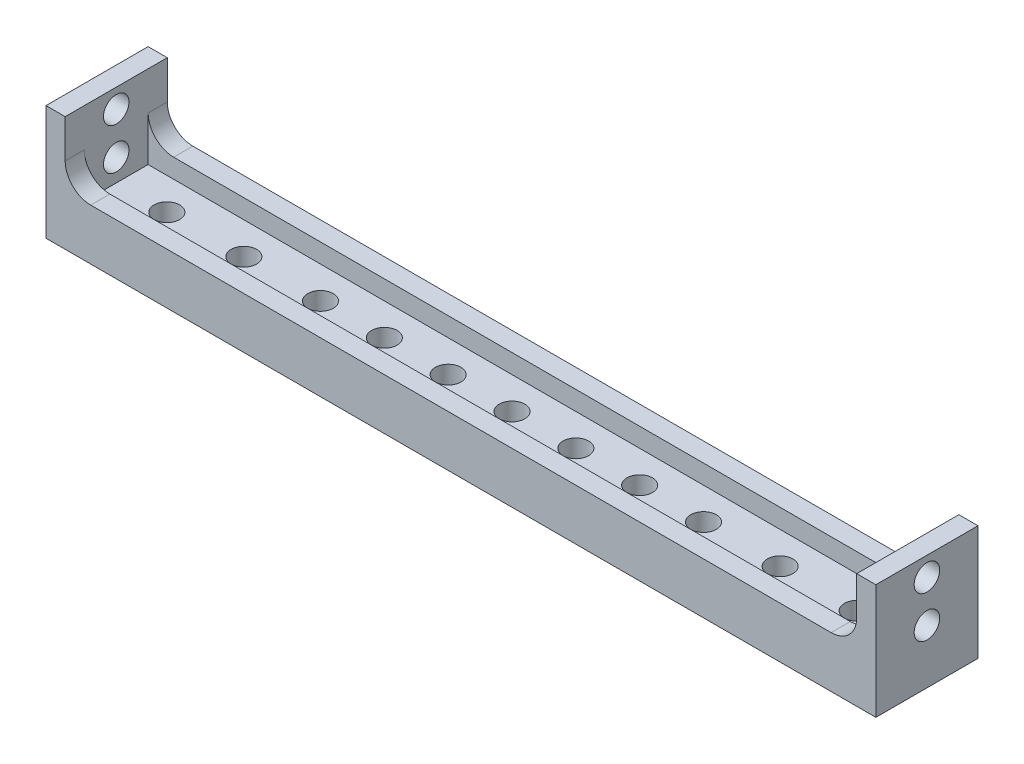
ISO-10303-21;
HEADER;
FILE_DESCRIPTION(('STEP AP214'),'2;1');
FILE_NAME('part.step','',(''),(''),'','','');
FILE_SCHEMA(('AUTOMOTIVE_DESIGN { 1 0 10303 214 1 1 1 1 }'));
ENDSEC;
DATA;
#1=APPLICATION_CONTEXT('core data for automotive mechanical design processes');
#2=APPLICATION_PROTOCOL_DEFINITION('international standard','automotive_design',2000,#1);
#3=PRODUCT_CONTEXT('',#1,'mechanical');
#4=PRODUCT('Part','Part','',(#3));
#5=PRODUCT_RELATED_PRODUCT_CATEGORY('part','',(#4));
#6=PRODUCT_DEFINITION_FORMATION('','',#4);
#7=PRODUCT_DEFINITION_CONTEXT('part definition',#1,'design');
#8=PRODUCT_DEFINITION('design','',#6,#7);
#9=PRODUCT_DEFINITION_SHAPE('','',#8);
#10=(LENGTH_UNIT() NAMED_UNIT(*) SI_UNIT(.MILLI.,.METRE.));
#11=(NAMED_UNIT(*) PLANE_ANGLE_UNIT() SI_UNIT($,.RADIAN.));
#12=(NAMED_UNIT(*) SI_UNIT($,.STERADIAN.) SOLID_ANGLE_UNIT());
#13=UNCERTAINTY_MEASURE_WITH_UNIT(LENGTH_MEASURE(1.E-05),#10,'distance_accuracy_value','');
#14=(GEOMETRIC_REPRESENTATION_CONTEXT(3) GLOBAL_UNCERTAINTY_ASSIGNED_CONTEXT((#13)) GLOBAL_UNIT_ASSIGNED_CONTEXT((#10,
#11,#12)) REPRESENTATION_CONTEXT('',''));
#15=CARTESIAN_POINT('',(0.,0.,0.));
#16=DIRECTION('',(0.,0.,1.));
#17=DIRECTION('',(1.,0.,0.));
#18=AXIS2_PLACEMENT_3D('',#15,#16,#17);
#19=CARTESIAN_POINT('',(-42.,-5.,0.));
#20=DIRECTION('',(0.,1.,0.));
#21=DIRECTION('',(0.,0.,1.));
#22=AXIS2_PLACEMENT_3D('',#19,#20,#21);
#23=CYLINDRICAL_SURFACE('',#22,2.);
#24=CARTESIAN_POINT('',(-42.,5.,0.));
#25=DIRECTION('',(0.,1.,0.));
#26=DIRECTION('',(0.,0.,1.));
#27=AXIS2_PLACEMENT_3D('',#24,#25,#26);
#28=CIRCLE('',#27,2.);
#29=CARTESIAN_POINT('',(-42.,5.,2.00000000000001));
#30=VERTEX_POINT('',#29);
#31=EDGE_CURVE('E182',#30,#30,#28,.T.);
#32=ORIENTED_EDGE('',*,*,#31,.T.);
#33=EDGE_LOOP('',(#32));
#34=FACE_BOUND('',#33,.T.);
#35=CARTESIAN_POINT('',(-42.,2.,0.));
#36=DIRECTION('',(0.,-1.,0.));
#37=DIRECTION('',(0.,0.,-1.));
#38=AXIS2_PLACEMENT_3D('',#35,#36,#37);
#39=CIRCLE('',#38,2.);
#40=CARTESIAN_POINT('',(-42.,2.,-2.));
#41=VERTEX_POINT('',#40);
#42=EDGE_CURVE('E288',#41,#41,#39,.F.);
#43=ORIENTED_EDGE('',*,*,#42,.F.);
#44=EDGE_LOOP('',(#43));
#45=FACE_BOUND('',#44,.T.);
#46=ADVANCED_FACE('F38',(#34,#45),#23,.F.);
#47=CARTESIAN_POINT('',(42.,-5.,0.));
#48=DIRECTION('',(0.,1.,0.));
#49=DIRECTION('',(0.,0.,1.));
#50=AXIS2_PLACEMENT_3D('',#47,#48,#49);
#51=CYLINDRICAL_SURFACE('',#50,2.);
#52=CARTESIAN_POINT('',(42.,5.,0.));
#53=DIRECTION('',(0.,1.,0.));
#54=DIRECTION('',(0.,0.,1.));
#55=AXIS2_PLACEMENT_3D('',#52,#53,#54);
#56=CIRCLE('',#55,2.);
#57=CARTESIAN_POINT('',(42.,5.,2.));
#58=VERTEX_POINT('',#57);
#59=EDGE_CURVE('E179',#58,#58,#56,.T.);
#60=ORIENTED_EDGE('',*,*,#59,.T.);
#61=EDGE_LOOP('',(#60));
#62=FACE_BOUND('',#61,.T.);
#63=CARTESIAN_POINT('',(42.,2.,0.));
#64=DIRECTION('',(0.,-1.,0.));
#65=DIRECTION('',(0.,0.,-1.));
#66=AXIS2_PLACEMENT_3D('',#63,#64,#65);
#67=CIRCLE('',#66,2.);
#68=CARTESIAN_POINT('',(42.,2.,-2.));
#69=VERTEX_POINT('',#68);
#70=EDGE_CURVE('E285',#69,#69,#67,.F.);
#71=ORIENTED_EDGE('',*,*,#70,.F.);
#72=EDGE_LOOP('',(#71));
#73=FACE_BOUND('',#72,.T.);
#74=ADVANCED_FACE('F454',(#62,#73),#51,.F.);
#75=CARTESIAN_POINT('',(0.,8.,0.));
#76=DIRECTION('',(0.,1.,0.));
#77=DIRECTION('',(0.,0.,1.));
#78=AXIS2_PLACEMENT_3D('',#75,#76,#77);
#79=PLANE('',#78);
#80=DIRECTION('',(1.,0.,0.));
#81=VECTOR('',#80,1.);
#82=CARTESIAN_POINT('',(-65.,8.,8.));
#83=LINE('',#82,#81);
#84=CARTESIAN_POINT('',(-58.,8.,8.));
#85=VERTEX_POINT('',#84);
#86=CARTESIAN_POINT('',(58.,8.,8.));
#87=VERTEX_POINT('',#86);
#88=EDGE_CURVE('E232',#85,#87,#83,.T.);
#89=ORIENTED_EDGE('',*,*,#88,.T.);
#90=DIRECTION('',(0.,0.,1.));
#91=VECTOR('',#90,1.);
#92=CARTESIAN_POINT('',(58.,8.,5.));
#93=LINE('',#92,#91);
#94=CARTESIAN_POINT('',(58.,8.,5.));
#95=VERTEX_POINT('',#94);
#96=EDGE_CURVE('E260',#87,#95,#93,.F.);
#97=ORIENTED_EDGE('',*,*,#96,.T.);
#98=DIRECTION('',(1.,0.,0.));
#99=VECTOR('',#98,1.);
#100=CARTESIAN_POINT('',(-62.,8.,5.));
#101=LINE('',#100,#99);
#102=CARTESIAN_POINT('',(-58.,8.,5.));
#103=VERTEX_POINT('',#102);
#104=EDGE_CURVE('E209',#103,#95,#101,.T.);
#105=ORIENTED_EDGE('',*,*,#104,.F.);
#106=DIRECTION('',(0.,0.,-1.));
#107=VECTOR('',#106,1.);
#108=CARTESIAN_POINT('',(-58.,8.,8.));
#109=LINE('',#108,#107);
#110=EDGE_CURVE('E258',#103,#85,#109,.F.);
#111=ORIENTED_EDGE('',*,*,#110,.T.);
#112=EDGE_LOOP('',(#89,#97,#105,#111));
#113=FACE_BOUND('',#112,.T.);
#114=ADVANCED_FACE('F434',(#113),#79,.T.);
#115=DIRECTION('',(-1.,0.,0.));
#116=VECTOR('',#115,1.);
#117=CARTESIAN_POINT('',(-62.,8.,-4.99999999999999));
#118=LINE('',#117,#116);
#119=CARTESIAN_POINT('',(58.,8.,-4.99999999999999));
#120=VERTEX_POINT('',#119);
#121=CARTESIAN_POINT('',(-58.,8.,-4.99999999999999));
#122=VERTEX_POINT('',#121);
#123=EDGE_CURVE('E212',#120,#122,#118,.T.);
#124=ORIENTED_EDGE('',*,*,#123,.F.);
#125=DIRECTION('',(0.,0.,1.));
#126=VECTOR('',#125,1.);
#127=CARTESIAN_POINT('',(58.,8.,-7.99999999999999));
#128=LINE('',#127,#126);
#129=CARTESIAN_POINT('',(58.,8.,-7.99999999999999));
#130=VERTEX_POINT('',#129);
#131=EDGE_CURVE('E264',#120,#130,#128,.F.);
#132=ORIENTED_EDGE('',*,*,#131,.T.);
#133=DIRECTION('',(-1.,0.,0.));
#134=VECTOR('',#133,1.);
#135=CARTESIAN_POINT('',(-65.,8.,-7.99999999999999));
#136=LINE('',#135,#134);
#137=CARTESIAN_POINT('',(-58.,8.,-7.99999999999999));
#138=VERTEX_POINT('',#137);
#139=EDGE_CURVE('E235',#130,#138,#136,.T.);
#140=ORIENTED_EDGE('',*,*,#139,.T.);
#141=DIRECTION('',(0.,0.,-1.));
#142=VECTOR('',#141,1.);
#143=CARTESIAN_POINT('',(-58.,8.,-4.99999999999999));
#144=LINE('',#143,#142);
#145=EDGE_CURVE('E262',#138,#122,#144,.F.);
#146=ORIENTED_EDGE('',*,*,#145,.T.);
#147=EDGE_LOOP('',(#124,#132,#140,#146));
#148=FACE_BOUND('',#147,.T.);
#149=ADVANCED_FACE('F408',(#148),#79,.T.);
#150=CARTESIAN_POINT('',(-65.,5.,-7.99999999999999));
#151=DIRECTION('',(1.,0.,0.));
#152=DIRECTION('',(0.,0.,-1.));
#153=AXIS2_PLACEMENT_3D('',#150,#151,#152);
#154=PLANE('',#153);
#155=CARTESIAN_POINT('',(-65.,15.,0.));
#156=DIRECTION('',(1.,0.,0.));
#157=DIRECTION('',(0.,0.,-1.));
#158=AXIS2_PLACEMENT_3D('',#155,#156,#157);
#159=CIRCLE('',#158,2.);
#160=CARTESIAN_POINT('',(-65.,15.,-1.99999999999999));
#161=VERTEX_POINT('',#160);
#162=EDGE_CURVE('E294',#161,#161,#159,.T.);
#163=ORIENTED_EDGE('',*,*,#162,.T.);
#164=EDGE_LOOP('',(#163));
#165=FACE_BOUND('',#164,.T.);
#166=CARTESIAN_POINT('',(-65.,8.5,0.));
#167=DIRECTION('',(1.,0.,0.));
#168=DIRECTION('',(0.,0.,-1.));
#169=AXIS2_PLACEMENT_3D('',#166,#167,#168);
#170=CIRCLE('',#169,2.);
#171=CARTESIAN_POINT('',(-65.,8.5,-2.));
#172=VERTEX_POINT('',#171);
#173=EDGE_CURVE('E308',#172,#172,#170,.T.);
#174=ORIENTED_EDGE('',*,*,#173,.T.);
#175=EDGE_LOOP('',(#174));
#176=FACE_BOUND('',#175,.T.);
#177=DIRECTION('',(0.,0.,1.));
#178=VECTOR('',#177,1.);
#179=CARTESIAN_POINT('',(-65.,0.,-7.99999999999999));
#180=LINE('',#179,#178);
#181=CARTESIAN_POINT('',(-65.,0.,-7.99999999999999));
#182=VERTEX_POINT('',#181);
#183=CARTESIAN_POINT('',(-65.,0.,8.00000000000001));
#184=VERTEX_POINT('',#183);
#185=EDGE_CURVE('E238',#182,#184,#180,.T.);
#186=ORIENTED_EDGE('',*,*,#185,.T.);
#187=DIRECTION('',(0.,-1.,0.));
#188=VECTOR('',#187,1.);
#189=CARTESIAN_POINT('',(-65.,5.,8.00000000000001));
#190=LINE('',#189,#188);
#191=CARTESIAN_POINT('',(-65.,18.,8.));
#192=VERTEX_POINT('',#191);
#193=EDGE_CURVE('E249',#192,#184,#190,.T.);
#194=ORIENTED_EDGE('',*,*,#193,.F.);
#195=DIRECTION('',(0.,0.,1.));
#196=VECTOR('',#195,1.);
#197=CARTESIAN_POINT('',(-65.,18.,-7.99999999999999));
#198=LINE('',#197,#196);
#199=CARTESIAN_POINT('',(-65.,18.,-7.99999999999999));
#200=VERTEX_POINT('',#199);
#201=EDGE_CURVE('E192',#200,#192,#198,.T.);
#202=ORIENTED_EDGE('',*,*,#201,.F.);
#203=DIRECTION('',(0.,-1.,0.));
#204=VECTOR('',#203,1.);
#205=CARTESIAN_POINT('',(-65.,5.,-7.99999999999999));
#206=LINE('',#205,#204);
#207=EDGE_CURVE('E164',#200,#182,#206,.T.);
#208=ORIENTED_EDGE('',*,*,#207,.T.);
#209=EDGE_LOOP('',(#186,#194,#202,#208));
#210=FACE_BOUND('',#209,.T.);
#211=ADVANCED_FACE('F392',(#165,#176,#210),#154,.F.);
#212=CARTESIAN_POINT('',(65.,5.,8.));
#213=DIRECTION('',(0.,0.,-1.));
#214=DIRECTION('',(-1.,0.,0.));
#215=AXIS2_PLACEMENT_3D('',#212,#213,#214);
#216=PLANE('',#215);
#217=DIRECTION('',(1.,0.,0.));
#218=VECTOR('',#217,1.);
#219=CARTESIAN_POINT('',(65.,0.,8.));
#220=LINE('',#219,#218);
#221=CARTESIAN_POINT('',(65.,0.,8.));
#222=VERTEX_POINT('',#221);
#223=EDGE_CURVE('E241',#184,#222,#220,.T.);
#224=ORIENTED_EDGE('',*,*,#223,.T.);
#225=DIRECTION('',(0.,-1.,0.));
#226=VECTOR('',#225,1.);
#227=CARTESIAN_POINT('',(65.,5.,8.));
#228=LINE('',#227,#226);
#229=CARTESIAN_POINT('',(65.,18.,8.));
#230=VERTEX_POINT('',#229);
#231=EDGE_CURVE('E163',#230,#222,#228,.T.);
#232=ORIENTED_EDGE('',*,*,#231,.F.);
#233=DIRECTION('',(1.,0.,0.));
#234=VECTOR('',#233,1.);
#235=CARTESIAN_POINT('',(65.,18.,8.));
#236=LINE('',#235,#234);
#237=CARTESIAN_POINT('',(62.,18.,8.));
#238=VERTEX_POINT('',#237);
#239=EDGE_CURVE('E178',#238,#230,#236,.T.);
#240=ORIENTED_EDGE('',*,*,#239,.F.);
#241=DIRECTION('',(0.,-1.,0.));
#242=VECTOR('',#241,1.);
#243=CARTESIAN_POINT('',(62.,18.,8.));
#244=LINE('',#243,#242);
#245=CARTESIAN_POINT('',(62.,12.,8.));
#246=VERTEX_POINT('',#245);
#247=EDGE_CURVE('E188',#238,#246,#244,.T.);
#248=ORIENTED_EDGE('',*,*,#247,.T.);
#249=CARTESIAN_POINT('',(58.,12.,8.));
#250=DIRECTION('',(0.,0.,-1.));
#251=DIRECTION('',(-1.,0.,0.));
#252=AXIS2_PLACEMENT_3D('',#249,#250,#251);
#253=CIRCLE('',#252,4.);
#254=EDGE_CURVE('E271',#246,#87,#253,.T.);
#255=ORIENTED_EDGE('',*,*,#254,.T.);
#256=ORIENTED_EDGE('',*,*,#88,.F.);
#257=CARTESIAN_POINT('',(-58.,12.,8.00000000000001));
#258=DIRECTION('',(0.,0.,-1.));
#259=DIRECTION('',(-1.,0.,0.));
#260=AXIS2_PLACEMENT_3D('',#257,#258,#259);
#261=CIRCLE('',#260,4.);
#262=CARTESIAN_POINT('',(-62.,12.,8.));
#263=VERTEX_POINT('',#262);
#264=EDGE_CURVE('E282',#85,#263,#261,.T.);
#265=ORIENTED_EDGE('',*,*,#264,.T.);
#266=DIRECTION('',(0.,-1.,0.));
#267=VECTOR('',#266,1.);
#268=CARTESIAN_POINT('',(-62.,18.,8.));
#269=LINE('',#268,#267);
#270=CARTESIAN_POINT('',(-62.,18.,8.));
#271=VERTEX_POINT('',#270);
#272=EDGE_CURVE('E205',#271,#263,#269,.T.);
#273=ORIENTED_EDGE('',*,*,#272,.F.);
#274=DIRECTION('',(1.,0.,0.));
#275=VECTOR('',#274,1.);
#276=CARTESIAN_POINT('',(-65.,18.,8.));
#277=LINE('',#276,#275);
#278=EDGE_CURVE('E195',#192,#271,#277,.T.);
#279=ORIENTED_EDGE('',*,*,#278,.F.);
#280=ORIENTED_EDGE('',*,*,#193,.T.);
#281=EDGE_LOOP('',(#224,#232,#240,#248,#255,#256,#265,#273,#279,#280));
#282=FACE_BOUND('',#281,.T.);
#283=ADVANCED_FACE('F423',(#282),#216,.F.);
#284=CARTESIAN_POINT('',(65.,5.,-8.00000000000001));
#285=DIRECTION('',(-1.,0.,0.));
#286=DIRECTION('',(0.,0.,1.));
#287=AXIS2_PLACEMENT_3D('',#284,#285,#286);
#288=PLANE('',#287);
#289=CARTESIAN_POINT('',(65.,15.,0.));
#290=DIRECTION('',(1.,0.,0.));
#291=DIRECTION('',(0.,0.,-1.));
#292=AXIS2_PLACEMENT_3D('',#289,#290,#291);
#293=CIRCLE('',#292,2.);
#294=CARTESIAN_POINT('',(65.,15.,-1.99999999999999));
#295=VERTEX_POINT('',#294);
#296=EDGE_CURVE('E300',#295,#295,#293,.T.);
#297=ORIENTED_EDGE('',*,*,#296,.F.);
#298=EDGE_LOOP('',(#297));
#299=FACE_BOUND('',#298,.T.);
#300=CARTESIAN_POINT('',(65.,8.5,0.));
#301=DIRECTION('',(1.,0.,0.));
#302=DIRECTION('',(0.,0.,-1.));
#303=AXIS2_PLACEMENT_3D('',#300,#301,#302);
#304=CIRCLE('',#303,2.);
#305=CARTESIAN_POINT('',(65.,8.5,-2.));
#306=VERTEX_POINT('',#305);
#307=EDGE_CURVE('E305',#306,#306,#304,.T.);
#308=ORIENTED_EDGE('',*,*,#307,.F.);
#309=EDGE_LOOP('',(#308));
#310=FACE_BOUND('',#309,.T.);
#311=DIRECTION('',(0.,0.,-1.));
#312=VECTOR('',#311,1.);
#313=CARTESIAN_POINT('',(65.,0.,-8.00000000000001));
#314=LINE('',#313,#312);
#315=CARTESIAN_POINT('',(65.,0.,-8.00000000000001));
#316=VERTEX_POINT('',#315);
#317=EDGE_CURVE('E160',#222,#316,#314,.T.);
#318=ORIENTED_EDGE('',*,*,#317,.T.);
#319=DIRECTION('',(0.,-1.,0.));
#320=VECTOR('',#319,1.);
#321=CARTESIAN_POINT('',(65.,5.,-8.00000000000001));
#322=LINE('',#321,#320);
#323=CARTESIAN_POINT('',(65.,18.,-7.99999999999999));
#324=VERTEX_POINT('',#323);
#325=EDGE_CURVE('E153',#324,#316,#322,.T.);
#326=ORIENTED_EDGE('',*,*,#325,.F.);
#327=DIRECTION('',(0.,0.,-1.));
#328=VECTOR('',#327,1.);
#329=CARTESIAN_POINT('',(65.,18.,-7.99999999999999));
#330=LINE('',#329,#328);
#331=EDGE_CURVE('E158',#230,#324,#330,.T.);
#332=ORIENTED_EDGE('',*,*,#331,.F.);
#333=ORIENTED_EDGE('',*,*,#231,.T.);
#334=EDGE_LOOP('',(#318,#326,#332,#333));
#335=FACE_BOUND('',#334,.T.);
#336=ADVANCED_FACE('F155',(#299,#310,#335),#288,.F.);
#337=CARTESIAN_POINT('',(65.,5.,-8.00000000000001));
#338=DIRECTION('',(0.,0.,1.));
#339=DIRECTION('',(1.,0.,0.));
#340=AXIS2_PLACEMENT_3D('',#337,#338,#339);
#341=PLANE('',#340);
#342=DIRECTION('',(-1.,0.,0.));
#343=VECTOR('',#342,1.);
#344=CARTESIAN_POINT('',(65.,0.,-8.00000000000001));
#345=LINE('',#344,#343);
#346=EDGE_CURVE('E244',#316,#182,#345,.T.);
#347=ORIENTED_EDGE('',*,*,#346,.T.);
#348=ORIENTED_EDGE('',*,*,#207,.F.);
#349=DIRECTION('',(-1.,0.,0.));
#350=VECTOR('',#349,1.);
#351=CARTESIAN_POINT('',(-65.,18.,-7.99999999999999));
#352=LINE('',#351,#350);
#353=CARTESIAN_POINT('',(-62.,18.,-7.99999999999999));
#354=VERTEX_POINT('',#353);
#355=EDGE_CURVE('E199',#354,#200,#352,.T.);
#356=ORIENTED_EDGE('',*,*,#355,.F.);
#357=DIRECTION('',(0.,-1.,0.));
#358=VECTOR('',#357,1.);
#359=CARTESIAN_POINT('',(-62.,18.,-7.99999999999999));
#360=LINE('',#359,#358);
#361=CARTESIAN_POINT('',(-62.,12.,-7.99999999999999));
#362=VERTEX_POINT('',#361);
#363=EDGE_CURVE('E202',#354,#362,#360,.T.);
#364=ORIENTED_EDGE('',*,*,#363,.T.);
#365=CARTESIAN_POINT('',(-58.,12.,-7.99999999999999));
#366=DIRECTION('',(0.,0.,1.));
#367=DIRECTION('',(1.,0.,0.));
#368=AXIS2_PLACEMENT_3D('',#365,#366,#367);
#369=CIRCLE('',#368,4.);
#370=EDGE_CURVE('E47',#362,#138,#369,.T.);
#371=ORIENTED_EDGE('',*,*,#370,.T.);
#372=ORIENTED_EDGE('',*,*,#139,.F.);
#373=CARTESIAN_POINT('',(58.,12.,-8.00000000000001));
#374=DIRECTION('',(0.,0.,1.));
#375=DIRECTION('',(1.,0.,0.));
#376=AXIS2_PLACEMENT_3D('',#373,#374,#375);
#377=CIRCLE('',#376,4.);
#378=CARTESIAN_POINT('',(62.,12.,-7.99999999999999));
#379=VERTEX_POINT('',#378);
#380=EDGE_CURVE('E278',#130,#379,#377,.T.);
#381=ORIENTED_EDGE('',*,*,#380,.T.);
#382=DIRECTION('',(0.,-1.,0.));
#383=VECTOR('',#382,1.);
#384=CARTESIAN_POINT('',(62.,18.,-7.99999999999999));
#385=LINE('',#384,#383);
#386=CARTESIAN_POINT('',(62.,18.,-7.99999999999999));
#387=VERTEX_POINT('',#386);
#388=EDGE_CURVE('E170',#387,#379,#385,.T.);
#389=ORIENTED_EDGE('',*,*,#388,.F.);
#390=DIRECTION('',(-1.,0.,0.));
#391=VECTOR('',#390,1.);
#392=CARTESIAN_POINT('',(65.,18.,-7.99999999999999));
#393=LINE('',#392,#391);
#394=EDGE_CURVE('E167',#324,#387,#393,.T.);
#395=ORIENTED_EDGE('',*,*,#394,.F.);
#396=ORIENTED_EDGE('',*,*,#325,.T.);
#397=EDGE_LOOP('',(#347,#348,#356,#364,#371,#372,#381,#389,#395,#396));
#398=FACE_BOUND('',#397,.T.);
#399=ADVANCED_FACE('F168',(#398),#341,.F.);
#400=CARTESIAN_POINT('',(0.,0.,0.));
#401=DIRECTION('',(0.,-1.,0.));
#402=DIRECTION('',(0.,0.,-1.));
#403=AXIS2_PLACEMENT_3D('',#400,#401,#402);
#404=PLANE('',#403);
#405=CARTESIAN_POINT('',(-54.0663958384968,0.,2.09488880330588E-13));
#406=DIRECTION('',(0.,-1.,0.));
#407=DIRECTION('',(0.,0.,-1.));
#408=AXIS2_PLACEMENT_3D('',#405,#406,#407);
#409=CIRCLE('',#408,2.);
#410=CARTESIAN_POINT('',(-54.0663958384968,0.,-1.99999999999979));
#411=VERTEX_POINT('',#410);
#412=EDGE_CURVE('E320',#411,#411,#409,.F.);
#413=ORIENTED_EDGE('',*,*,#412,.T.);
#414=EDGE_LOOP('',(#413));
#415=FACE_BOUND('',#414,.T.);
#416=CARTESIAN_POINT('',(-30.,0.,2.09488880330588E-13));
#417=DIRECTION('',(0.,-1.,0.));
#418=DIRECTION('',(0.,0.,-1.));
#419=AXIS2_PLACEMENT_3D('',#416,#417,#418);
#420=CIRCLE('',#419,2.);
#421=CARTESIAN_POINT('',(-30.,0.,-1.99999999999979));
#422=VERTEX_POINT('',#421);
#423=EDGE_CURVE('E340',#422,#422,#420,.F.);
#424=ORIENTED_EDGE('',*,*,#423,.T.);
#425=EDGE_LOOP('',(#424));
#426=FACE_BOUND('',#425,.T.);
#427=CARTESIAN_POINT('',(30.,0.,2.12958327282542E-13));
#428=DIRECTION('',(0.,-1.,0.));
#429=DIRECTION('',(0.,0.,-1.));
#430=AXIS2_PLACEMENT_3D('',#427,#428,#429);
#431=CIRCLE('',#430,2.);
#432=CARTESIAN_POINT('',(30.,0.,-1.99999999999979));
#433=VERTEX_POINT('',#432);
#434=EDGE_CURVE('E341',#433,#433,#431,.F.);
#435=ORIENTED_EDGE('',*,*,#434,.T.);
#436=EDGE_LOOP('',(#435));
#437=FACE_BOUND('',#436,.T.);
#438=CARTESIAN_POINT('',(20.,0.,1.43128700505679E-13));
#439=DIRECTION('',(0.,-1.,0.));
#440=DIRECTION('',(0.,0.,-1.));
#441=AXIS2_PLACEMENT_3D('',#438,#439,#440);
#442=CIRCLE('',#441,2.);
#443=CARTESIAN_POINT('',(20.,0.,-1.99999999999986));
#444=VERTEX_POINT('',#443);
#445=EDGE_CURVE('E328',#444,#444,#442,.F.);
#446=ORIENTED_EDGE('',*,*,#445,.T.);
#447=EDGE_LOOP('',(#446));
#448=FACE_BOUND('',#447,.T.);
#449=CARTESIAN_POINT('',(10.,0.,0.));
#450=DIRECTION('',(0.,-1.,0.));
#451=DIRECTION('',(0.,0.,-1.));
#452=AXIS2_PLACEMENT_3D('',#449,#450,#451);
#453=CIRCLE('',#452,2.);
#454=CARTESIAN_POINT('',(10.,0.,-1.99999999999993));
#455=VERTEX_POINT('',#454);
#456=EDGE_CURVE('E329',#455,#455,#453,.F.);
#457=ORIENTED_EDGE('',*,*,#456,.T.);
#458=EDGE_LOOP('',(#457));
#459=FACE_BOUND('',#458,.T.);
#460=CARTESIAN_POINT('',(-20.,0.,1.39659253553725E-13));
#461=DIRECTION('',(0.,-1.,0.));
#462=DIRECTION('',(0.,0.,-1.));
#463=AXIS2_PLACEMENT_3D('',#460,#461,#462);
#464=CIRCLE('',#463,2.);
#465=CARTESIAN_POINT('',(-20.,0.,-1.99999999999986));
#466=VERTEX_POINT('',#465);
#467=EDGE_CURVE('E364',#466,#466,#464,.F.);
#468=ORIENTED_EDGE('',*,*,#467,.T.);
#469=EDGE_LOOP('',(#468));
#470=FACE_BOUND('',#469,.T.);
#471=CARTESIAN_POINT('',(-10.,0.,0.));
#472=DIRECTION('',(0.,-1.,0.));
#473=DIRECTION('',(0.,0.,-1.));
#474=AXIS2_PLACEMENT_3D('',#471,#472,#473);
#475=CIRCLE('',#474,2.);
#476=CARTESIAN_POINT('',(-10.,0.,-1.99999999999993));
#477=VERTEX_POINT('',#476);
#478=EDGE_CURVE('E358',#477,#477,#475,.F.);
#479=ORIENTED_EDGE('',*,*,#478,.T.);
#480=EDGE_LOOP('',(#479));
#481=FACE_BOUND('',#480,.T.);
#482=CARTESIAN_POINT('',(54.0663958384968,0.,2.12958327282542E-13));
#483=DIRECTION('',(0.,-1.,0.));
#484=DIRECTION('',(0.,0.,-1.));
#485=AXIS2_PLACEMENT_3D('',#482,#483,#484);
#486=CIRCLE('',#485,2.);
#487=CARTESIAN_POINT('',(54.0663958384968,0.,-1.99999999999979));
#488=VERTEX_POINT('',#487);
#489=EDGE_CURVE('E352',#488,#488,#486,.F.);
#490=ORIENTED_EDGE('',*,*,#489,.T.);
#491=EDGE_LOOP('',(#490));
#492=FACE_BOUND('',#491,.T.);
#493=CARTESIAN_POINT('',(0.,0.,0.));
#494=DIRECTION('',(0.,-1.,0.));
#495=DIRECTION('',(0.,0.,-1.));
#496=AXIS2_PLACEMENT_3D('',#493,#494,#495);
#497=CIRCLE('',#496,2.);
#498=CARTESIAN_POINT('',(0.,0.,-2.));
#499=VERTEX_POINT('',#498);
#500=EDGE_CURVE('E321',#499,#499,#497,.F.);
#501=ORIENTED_EDGE('',*,*,#500,.T.);
#502=EDGE_LOOP('',(#501));
#503=FACE_BOUND('',#502,.T.);
#504=CARTESIAN_POINT('',(42.,0.,0.));
#505=DIRECTION('',(0.,-1.,0.));
#506=DIRECTION('',(0.,0.,-1.));
#507=AXIS2_PLACEMENT_3D('',#504,#505,#506);
#508=CIRCLE('',#507,4.);
#509=CARTESIAN_POINT('',(42.,0.,-4.));
#510=VERTEX_POINT('',#509);
#511=EDGE_CURVE('E373',#510,#510,#508,.T.);
#512=ORIENTED_EDGE('',*,*,#511,.F.);
#513=EDGE_LOOP('',(#512));
#514=FACE_BOUND('',#513,.T.);
#515=CARTESIAN_POINT('',(-42.,0.,0.));
#516=DIRECTION('',(0.,-1.,0.));
#517=DIRECTION('',(0.,0.,-1.));
#518=AXIS2_PLACEMENT_3D('',#515,#516,#517);
#519=CIRCLE('',#518,4.);
#520=CARTESIAN_POINT('',(-42.,0.,-3.99999999999999));
#521=VERTEX_POINT('',#520);
#522=EDGE_CURVE('E324',#521,#521,#519,.T.);
#523=ORIENTED_EDGE('',*,*,#522,.F.);
#524=EDGE_LOOP('',(#523));
#525=FACE_BOUND('',#524,.T.);
#526=ORIENTED_EDGE('',*,*,#185,.F.);
#527=ORIENTED_EDGE('',*,*,#346,.F.);
#528=ORIENTED_EDGE('',*,*,#317,.F.);
#529=ORIENTED_EDGE('',*,*,#223,.F.);
#530=EDGE_LOOP('',(#526,#527,#528,#529));
#531=FACE_BOUND('',#530,.T.);
#532=ADVANCED_FACE('F384',(#415,#426,#437,#448,#459,#470,#481,#492,#503,#514,#525,#531),#404,.T.);
#533=CARTESIAN_POINT('',(-62.,8.,-4.99999999999999));
#534=DIRECTION('',(1.,0.,0.));
#535=DIRECTION('',(0.,0.,-1.));
#536=AXIS2_PLACEMENT_3D('',#533,#534,#535);
#537=PLANE('',#536);
#538=CARTESIAN_POINT('',(-62.,15.,0.));
#539=DIRECTION('',(1.,0.,0.));
#540=DIRECTION('',(0.,0.,-1.));
#541=AXIS2_PLACEMENT_3D('',#538,#539,#540);
#542=CIRCLE('',#541,2.);
#543=CARTESIAN_POINT('',(-62.,15.,-1.99999999999999));
#544=VERTEX_POINT('',#543);
#545=EDGE_CURVE('E313',#544,#544,#542,.T.);
#546=ORIENTED_EDGE('',*,*,#545,.F.);
#547=EDGE_LOOP('',(#546));
#548=FACE_BOUND('',#547,.T.);
#549=CARTESIAN_POINT('',(-62.,8.5,0.));
#550=DIRECTION('',(1.,0.,0.));
#551=DIRECTION('',(0.,0.,-1.));
#552=AXIS2_PLACEMENT_3D('',#549,#550,#551);
#553=CIRCLE('',#552,2.);
#554=CARTESIAN_POINT('',(-62.,8.5,-2.));
#555=VERTEX_POINT('',#554);
#556=EDGE_CURVE('E293',#555,#555,#553,.T.);
#557=ORIENTED_EDGE('',*,*,#556,.F.);
#558=EDGE_LOOP('',(#557));
#559=FACE_BOUND('',#558,.T.);
#560=ORIENTED_EDGE('',*,*,#272,.T.);
#561=DIRECTION('',(0.,0.,-1.));
#562=VECTOR('',#561,1.);
#563=CARTESIAN_POINT('',(-62.,12.,5.));
#564=LINE('',#563,#562);
#565=CARTESIAN_POINT('',(-62.,12.,5.));
#566=VERTEX_POINT('',#565);
#567=EDGE_CURVE('E268',#263,#566,#564,.T.);
#568=ORIENTED_EDGE('',*,*,#567,.T.);
#569=DIRECTION('',(0.,-1.,0.));
#570=VECTOR('',#569,1.);
#571=CARTESIAN_POINT('',(-62.,8.,5.));
#572=LINE('',#571,#570);
#573=CARTESIAN_POINT('',(-62.,5.,5.));
#574=VERTEX_POINT('',#573);
#575=EDGE_CURVE('E55',#566,#574,#572,.T.);
#576=ORIENTED_EDGE('',*,*,#575,.T.);
#577=DIRECTION('',(0.,0.,1.));
#578=VECTOR('',#577,1.);
#579=CARTESIAN_POINT('',(-62.,5.,-4.99999999999999));
#580=LINE('',#579,#578);
#581=CARTESIAN_POINT('',(-62.,5.,-4.99999999999999));
#582=VERTEX_POINT('',#581);
#583=EDGE_CURVE('E208',#582,#574,#580,.T.);
#584=ORIENTED_EDGE('',*,*,#583,.F.);
#585=DIRECTION('',(0.,-1.,0.));
#586=VECTOR('',#585,1.);
#587=CARTESIAN_POINT('',(-62.,8.,-4.99999999999999));
#588=LINE('',#587,#586);
#589=CARTESIAN_POINT('',(-62.,12.,-4.99999999999999));
#590=VERTEX_POINT('',#589);
#591=EDGE_CURVE('E63',#590,#582,#588,.T.);
#592=ORIENTED_EDGE('',*,*,#591,.F.);
#593=DIRECTION('',(0.,0.,-1.));
#594=VECTOR('',#593,1.);
#595=CARTESIAN_POINT('',(-62.,12.,-7.99999999999999));
#596=LINE('',#595,#594);
#597=EDGE_CURVE('E266',#590,#362,#596,.T.);
#598=ORIENTED_EDGE('',*,*,#597,.T.);
#599=ORIENTED_EDGE('',*,*,#363,.F.);
#600=DIRECTION('',(0.,0.,-1.));
#601=VECTOR('',#600,1.);
#602=CARTESIAN_POINT('',(-62.,18.,-7.99999999999999));
#603=LINE('',#602,#601);
#604=EDGE_CURVE('E197',#271,#354,#603,.T.);
#605=ORIENTED_EDGE('',*,*,#604,.F.);
#606=EDGE_LOOP('',(#560,#568,#576,#584,#592,#598,#599,#605));
#607=FACE_BOUND('',#606,.T.);
#608=ADVANCED_FACE('F387',(#548,#559,#607),#537,.T.);
#609=CARTESIAN_POINT('',(-62.,8.,5.));
#610=DIRECTION('',(0.,0.,-1.));
#611=DIRECTION('',(-1.,0.,0.));
#612=AXIS2_PLACEMENT_3D('',#609,#610,#611);
#613=PLANE('',#612);
#614=DIRECTION('',(1.,0.,0.));
#615=VECTOR('',#614,1.);
#616=CARTESIAN_POINT('',(-62.,5.,5.));
#617=LINE('',#616,#615);
#618=CARTESIAN_POINT('',(62.,5.,5.));
#619=VERTEX_POINT('',#618);
#620=EDGE_CURVE('E218',#574,#619,#617,.T.);
#621=ORIENTED_EDGE('',*,*,#620,.F.);
#622=ORIENTED_EDGE('',*,*,#575,.F.);
#623=CARTESIAN_POINT('',(-58.,12.,5.));
#624=DIRECTION('',(0.,0.,-1.));
#625=DIRECTION('',(-1.,0.,0.));
#626=AXIS2_PLACEMENT_3D('',#623,#624,#625);
#627=CIRCLE('',#626,4.);
#628=EDGE_CURVE('E280',#566,#103,#627,.F.);
#629=ORIENTED_EDGE('',*,*,#628,.T.);
#630=ORIENTED_EDGE('',*,*,#104,.T.);
#631=CARTESIAN_POINT('',(58.,12.,5.));
#632=DIRECTION('',(0.,0.,-1.));
#633=DIRECTION('',(-1.,0.,0.));
#634=AXIS2_PLACEMENT_3D('',#631,#632,#633);
#635=CIRCLE('',#634,4.);
#636=CARTESIAN_POINT('',(62.,12.,5.));
#637=VERTEX_POINT('',#636);
#638=EDGE_CURVE('E273',#95,#637,#635,.F.);
#639=ORIENTED_EDGE('',*,*,#638,.T.);
#640=DIRECTION('',(0.,-1.,0.));
#641=VECTOR('',#640,1.);
#642=CARTESIAN_POINT('',(62.,8.,5.));
#643=LINE('',#642,#641);
#644=EDGE_CURVE('E229',#637,#619,#643,.T.);
#645=ORIENTED_EDGE('',*,*,#644,.T.);
#646=EDGE_LOOP('',(#621,#622,#629,#630,#639,#645));
#647=FACE_BOUND('',#646,.T.);
#648=ADVANCED_FACE('F431',(#647),#613,.T.);
#649=CARTESIAN_POINT('',(62.,8.,-4.99999999999999));
#650=DIRECTION('',(-1.,0.,0.));
#651=DIRECTION('',(0.,0.,1.));
#652=AXIS2_PLACEMENT_3D('',#649,#650,#651);
#653=PLANE('',#652);
#654=CARTESIAN_POINT('',(62.,15.,0.));
#655=DIRECTION('',(-1.,0.,0.));
#656=DIRECTION('',(0.,0.,1.));
#657=AXIS2_PLACEMENT_3D('',#654,#655,#656);
#658=CIRCLE('',#657,2.);
#659=CARTESIAN_POINT('',(62.,15.,2.00000000000001));
#660=VERTEX_POINT('',#659);
#661=EDGE_CURVE('E42',#660,#660,#658,.T.);
#662=ORIENTED_EDGE('',*,*,#661,.F.);
#663=EDGE_LOOP('',(#662));
#664=FACE_BOUND('',#663,.T.);
#665=CARTESIAN_POINT('',(62.,8.5,0.));
#666=DIRECTION('',(-1.,0.,0.));
#667=DIRECTION('',(0.,0.,1.));
#668=AXIS2_PLACEMENT_3D('',#665,#666,#667);
#669=CIRCLE('',#668,2.);
#670=CARTESIAN_POINT('',(62.,8.5,2.));
#671=VERTEX_POINT('',#670);
#672=EDGE_CURVE('E291',#671,#671,#669,.T.);
#673=ORIENTED_EDGE('',*,*,#672,.F.);
#674=EDGE_LOOP('',(#673));
#675=FACE_BOUND('',#674,.T.);
#676=ORIENTED_EDGE('',*,*,#644,.F.);
#677=DIRECTION('',(0.,0.,1.));
#678=VECTOR('',#677,1.);
#679=CARTESIAN_POINT('',(62.,12.,8.));
#680=LINE('',#679,#678);
#681=EDGE_CURVE('E255',#637,#246,#680,.T.);
#682=ORIENTED_EDGE('',*,*,#681,.T.);
#683=ORIENTED_EDGE('',*,*,#247,.F.);
#684=DIRECTION('',(0.,0.,1.));
#685=VECTOR('',#684,1.);
#686=CARTESIAN_POINT('',(62.,18.,-7.99999999999999));
#687=LINE('',#686,#685);
#688=EDGE_CURVE('E173',#387,#238,#687,.T.);
#689=ORIENTED_EDGE('',*,*,#688,.F.);
#690=ORIENTED_EDGE('',*,*,#388,.T.);
#691=DIRECTION('',(0.,0.,1.));
#692=VECTOR('',#691,1.);
#693=CARTESIAN_POINT('',(62.,12.,-4.99999999999999));
#694=LINE('',#693,#692);
#695=CARTESIAN_POINT('',(62.,12.,-4.99999999999999));
#696=VERTEX_POINT('',#695);
#697=EDGE_CURVE('E252',#379,#696,#694,.T.);
#698=ORIENTED_EDGE('',*,*,#697,.T.);
#699=DIRECTION('',(0.,-1.,0.));
#700=VECTOR('',#699,1.);
#701=CARTESIAN_POINT('',(62.,8.,-4.99999999999999));
#702=LINE('',#701,#700);
#703=CARTESIAN_POINT('',(62.,5.,-4.99999999999999));
#704=VERTEX_POINT('',#703);
#705=EDGE_CURVE('E227',#696,#704,#702,.T.);
#706=ORIENTED_EDGE('',*,*,#705,.T.);
#707=DIRECTION('',(0.,0.,-1.));
#708=VECTOR('',#707,1.);
#709=CARTESIAN_POINT('',(62.,5.,-4.99999999999999));
#710=LINE('',#709,#708);
#711=EDGE_CURVE('E221',#619,#704,#710,.T.);
#712=ORIENTED_EDGE('',*,*,#711,.F.);
#713=EDGE_LOOP('',(#676,#682,#683,#689,#690,#698,#706,#712));
#714=FACE_BOUND('',#713,.T.);
#715=ADVANCED_FACE('F419',(#664,#675,#714),#653,.T.);
#716=CARTESIAN_POINT('',(-62.,8.,-4.99999999999999));
#717=DIRECTION('',(0.,0.,1.));
#718=DIRECTION('',(1.,0.,0.));
#719=AXIS2_PLACEMENT_3D('',#716,#717,#718);
#720=PLANE('',#719);
#721=DIRECTION('',(-1.,0.,0.));
#722=VECTOR('',#721,1.);
#723=CARTESIAN_POINT('',(-62.,5.,-4.99999999999999));
#724=LINE('',#723,#722);
#725=EDGE_CURVE('E213',#704,#582,#724,.T.);
#726=ORIENTED_EDGE('',*,*,#725,.F.);
#727=ORIENTED_EDGE('',*,*,#705,.F.);
#728=CARTESIAN_POINT('',(58.,12.,-4.99999999999999));
#729=DIRECTION('',(0.,0.,1.));
#730=DIRECTION('',(1.,0.,0.));
#731=AXIS2_PLACEMENT_3D('',#728,#729,#730);
#732=CIRCLE('',#731,4.);
#733=EDGE_CURVE('E276',#696,#120,#732,.F.);
#734=ORIENTED_EDGE('',*,*,#733,.T.);
#735=ORIENTED_EDGE('',*,*,#123,.T.);
#736=CARTESIAN_POINT('',(-58.,12.,-4.99999999999999));
#737=DIRECTION('',(0.,0.,1.));
#738=DIRECTION('',(1.,0.,0.));
#739=AXIS2_PLACEMENT_3D('',#736,#737,#738);
#740=CIRCLE('',#739,4.);
#741=EDGE_CURVE('E11',#122,#590,#740,.F.);
#742=ORIENTED_EDGE('',*,*,#741,.T.);
#743=ORIENTED_EDGE('',*,*,#591,.T.);
#744=EDGE_LOOP('',(#726,#727,#734,#735,#742,#743));
#745=FACE_BOUND('',#744,.T.);
#746=ADVANCED_FACE('F413',(#745),#720,.T.);
#747=CARTESIAN_POINT('',(0.,5.,0.));
#748=DIRECTION('',(0.,-1.,0.));
#749=DIRECTION('',(0.,0.,-1.));
#750=AXIS2_PLACEMENT_3D('',#747,#748,#749);
#751=PLANE('',#750);
#752=CARTESIAN_POINT('',(-54.0663958384968,5.,2.09488880330588E-13));
#753=DIRECTION('',(0.,1.,0.));
#754=DIRECTION('',(0.,0.,1.));
#755=AXIS2_PLACEMENT_3D('',#752,#753,#754);
#756=CIRCLE('',#755,2.);
#757=CARTESIAN_POINT('',(-54.0663958384968,5.,2.00000000000021));
#758=VERTEX_POINT('',#757);
#759=EDGE_CURVE('E317',#758,#758,#756,.T.);
#760=ORIENTED_EDGE('',*,*,#759,.F.);
#761=EDGE_LOOP('',(#760));
#762=FACE_BOUND('',#761,.T.);
#763=CARTESIAN_POINT('',(-30.,5.,2.09488880330588E-13));
#764=DIRECTION('',(0.,1.,0.));
#765=DIRECTION('',(0.,0.,1.));
#766=AXIS2_PLACEMENT_3D('',#763,#764,#765);
#767=CIRCLE('',#766,2.);
#768=CARTESIAN_POINT('',(-30.,5.,2.00000000000021));
#769=VERTEX_POINT('',#768);
#770=EDGE_CURVE('E337',#769,#769,#767,.T.);
#771=ORIENTED_EDGE('',*,*,#770,.F.);
#772=EDGE_LOOP('',(#771));
#773=FACE_BOUND('',#772,.T.);
#774=CARTESIAN_POINT('',(30.,5.,2.12958327282542E-13));
#775=DIRECTION('',(0.,1.,0.));
#776=DIRECTION('',(0.,0.,-1.));
#777=AXIS2_PLACEMENT_3D('',#774,#775,#776);
#778=CIRCLE('',#777,2.);
#779=CARTESIAN_POINT('',(30.,5.,-1.99999999999979));
#780=VERTEX_POINT('',#779);
#781=EDGE_CURVE('E332',#780,#780,#778,.T.);
#782=ORIENTED_EDGE('',*,*,#781,.F.);
#783=EDGE_LOOP('',(#782));
#784=FACE_BOUND('',#783,.T.);
#785=CARTESIAN_POINT('',(20.,5.,1.43128700505679E-13));
#786=DIRECTION('',(0.,1.,0.));
#787=DIRECTION('',(0.,0.,-1.));
#788=AXIS2_PLACEMENT_3D('',#785,#786,#787);
#789=CIRCLE('',#788,2.);
#790=CARTESIAN_POINT('',(20.,5.,-1.99999999999986));
#791=VERTEX_POINT('',#790);
#792=EDGE_CURVE('E325',#791,#791,#789,.T.);
#793=ORIENTED_EDGE('',*,*,#792,.F.);
#794=EDGE_LOOP('',(#793));
#795=FACE_BOUND('',#794,.T.);
#796=CARTESIAN_POINT('',(10.,5.,0.));
#797=DIRECTION('',(0.,1.,0.));
#798=DIRECTION('',(0.,0.,-1.));
#799=AXIS2_PLACEMENT_3D('',#796,#797,#798);
#800=CIRCLE('',#799,2.);
#801=CARTESIAN_POINT('',(10.,5.,-1.99999999999993));
#802=VERTEX_POINT('',#801);
#803=EDGE_CURVE('E316',#802,#802,#800,.T.);
#804=ORIENTED_EDGE('',*,*,#803,.F.);
#805=EDGE_LOOP('',(#804));
#806=FACE_BOUND('',#805,.T.);
#807=CARTESIAN_POINT('',(-20.,5.,1.39659253553725E-13));
#808=DIRECTION('',(0.,1.,0.));
#809=DIRECTION('',(0.,0.,1.));
#810=AXIS2_PLACEMENT_3D('',#807,#808,#809);
#811=CIRCLE('',#810,2.);
#812=CARTESIAN_POINT('',(-20.,5.,2.00000000000014));
#813=VERTEX_POINT('',#812);
#814=EDGE_CURVE('E344',#813,#813,#811,.T.);
#815=ORIENTED_EDGE('',*,*,#814,.F.);
#816=EDGE_LOOP('',(#815));
#817=FACE_BOUND('',#816,.T.);
#818=CARTESIAN_POINT('',(-10.,5.,0.));
#819=DIRECTION('',(0.,1.,0.));
#820=DIRECTION('',(0.,0.,1.));
#821=AXIS2_PLACEMENT_3D('',#818,#819,#820);
#822=CIRCLE('',#821,2.);
#823=CARTESIAN_POINT('',(-10.,5.,2.00000000000007));
#824=VERTEX_POINT('',#823);
#825=EDGE_CURVE('E361',#824,#824,#822,.T.);
#826=ORIENTED_EDGE('',*,*,#825,.F.);
#827=EDGE_LOOP('',(#826));
#828=FACE_BOUND('',#827,.T.);
#829=CARTESIAN_POINT('',(54.0663958384968,5.,2.12958327282542E-13));
#830=DIRECTION('',(0.,1.,0.));
#831=DIRECTION('',(0.,0.,-1.));
#832=AXIS2_PLACEMENT_3D('',#829,#830,#831);
#833=CIRCLE('',#832,2.);
#834=CARTESIAN_POINT('',(54.0663958384968,5.,-1.99999999999979));
#835=VERTEX_POINT('',#834);
#836=EDGE_CURVE('E355',#835,#835,#833,.T.);
#837=ORIENTED_EDGE('',*,*,#836,.F.);
#838=EDGE_LOOP('',(#837));
#839=FACE_BOUND('',#838,.T.);
#840=CARTESIAN_POINT('',(0.,5.,0.));
#841=DIRECTION('',(0.,1.,0.));
#842=DIRECTION('',(0.,0.,1.));
#843=AXIS2_PLACEMENT_3D('',#840,#841,#842);
#844=CIRCLE('',#843,2.);
#845=CARTESIAN_POINT('',(0.,5.,2.));
#846=VERTEX_POINT('',#845);
#847=EDGE_CURVE('E349',#846,#846,#844,.T.);
#848=ORIENTED_EDGE('',*,*,#847,.F.);
#849=EDGE_LOOP('',(#848));
#850=FACE_BOUND('',#849,.T.);
#851=ORIENTED_EDGE('',*,*,#59,.F.);
#852=EDGE_LOOP('',(#851));
#853=FACE_BOUND('',#852,.T.);
#854=ORIENTED_EDGE('',*,*,#31,.F.);
#855=EDGE_LOOP('',(#854));
#856=FACE_BOUND('',#855,.T.);
#857=ORIENTED_EDGE('',*,*,#725,.T.);
#858=ORIENTED_EDGE('',*,*,#583,.T.);
#859=ORIENTED_EDGE('',*,*,#620,.T.);
#860=ORIENTED_EDGE('',*,*,#711,.T.);
#861=EDGE_LOOP('',(#857,#858,#859,#860));
#862=FACE_BOUND('',#861,.T.);
#863=ADVANCED_FACE('F440',(#762,#773,#784,#795,#806,#817,#828,#839,#850,#853,#856,#862),#751,.F.);
#864=CARTESIAN_POINT('',(0.,18.,0.));
#865=DIRECTION('',(0.,1.,0.));
#866=DIRECTION('',(0.,0.,1.));
#867=AXIS2_PLACEMENT_3D('',#864,#865,#866);
#868=PLANE('',#867);
#869=ORIENTED_EDGE('',*,*,#201,.T.);
#870=ORIENTED_EDGE('',*,*,#278,.T.);
#871=ORIENTED_EDGE('',*,*,#604,.T.);
#872=ORIENTED_EDGE('',*,*,#355,.T.);
#873=EDGE_LOOP('',(#869,#870,#871,#872));
#874=FACE_BOUND('',#873,.T.);
#875=ADVANCED_FACE('F397',(#874),#868,.T.);
#876=CARTESIAN_POINT('',(0.,18.,0.));
#877=DIRECTION('',(0.,-1.,0.));
#878=DIRECTION('',(0.,0.,-1.));
#879=AXIS2_PLACEMENT_3D('',#876,#877,#878);
#880=PLANE('',#879);
#881=ORIENTED_EDGE('',*,*,#331,.T.);
#882=ORIENTED_EDGE('',*,*,#394,.T.);
#883=ORIENTED_EDGE('',*,*,#688,.T.);
#884=ORIENTED_EDGE('',*,*,#239,.T.);
#885=EDGE_LOOP('',(#881,#882,#883,#884));
#886=FACE_BOUND('',#885,.T.);
#887=ADVANCED_FACE('F176',(#886),#880,.F.);
#888=CARTESIAN_POINT('',(58.,12.,-4.99999999999999));
#889=DIRECTION('',(0.,0.,-1.));
#890=DIRECTION('',(-1.,0.,0.));
#891=AXIS2_PLACEMENT_3D('',#888,#889,#890);
#892=CYLINDRICAL_SURFACE('',#891,4.);
#893=ORIENTED_EDGE('',*,*,#638,.F.);
#894=ORIENTED_EDGE('',*,*,#96,.F.);
#895=ORIENTED_EDGE('',*,*,#254,.F.);
#896=ORIENTED_EDGE('',*,*,#681,.F.);
#897=EDGE_LOOP('',(#893,#894,#895,#896));
#898=FACE_BOUND('',#897,.T.);
#899=ADVANCED_FACE('F437',(#898),#892,.F.);
#900=CARTESIAN_POINT('',(58.,12.,-4.99999999999999));
#901=DIRECTION('',(0.,0.,-1.));
#902=DIRECTION('',(-1.,0.,0.));
#903=AXIS2_PLACEMENT_3D('',#900,#901,#902);
#904=CYLINDRICAL_SURFACE('',#903,4.);
#905=ORIENTED_EDGE('',*,*,#380,.F.);
#906=ORIENTED_EDGE('',*,*,#131,.F.);
#907=ORIENTED_EDGE('',*,*,#733,.F.);
#908=ORIENTED_EDGE('',*,*,#697,.F.);
#909=EDGE_LOOP('',(#905,#906,#907,#908));
#910=FACE_BOUND('',#909,.T.);
#911=ADVANCED_FACE('F416',(#910),#904,.F.);
#912=CARTESIAN_POINT('',(-58.,12.,-4.99999999999999));
#913=DIRECTION('',(0.,0.,1.));
#914=DIRECTION('',(1.,0.,0.));
#915=AXIS2_PLACEMENT_3D('',#912,#913,#914);
#916=CYLINDRICAL_SURFACE('',#915,4.);
#917=ORIENTED_EDGE('',*,*,#264,.F.);
#918=ORIENTED_EDGE('',*,*,#110,.F.);
#919=ORIENTED_EDGE('',*,*,#628,.F.);
#920=ORIENTED_EDGE('',*,*,#567,.F.);
#921=EDGE_LOOP('',(#917,#918,#919,#920));
#922=FACE_BOUND('',#921,.T.);
#923=ADVANCED_FACE('F428',(#922),#916,.F.);
#924=CARTESIAN_POINT('',(-58.,12.,-4.99999999999999));
#925=DIRECTION('',(0.,0.,1.));
#926=DIRECTION('',(1.,0.,0.));
#927=AXIS2_PLACEMENT_3D('',#924,#925,#926);
#928=CYLINDRICAL_SURFACE('',#927,4.);
#929=ORIENTED_EDGE('',*,*,#741,.F.);
#930=ORIENTED_EDGE('',*,*,#145,.F.);
#931=ORIENTED_EDGE('',*,*,#370,.F.);
#932=ORIENTED_EDGE('',*,*,#597,.F.);
#933=EDGE_LOOP('',(#929,#930,#931,#932));
#934=FACE_BOUND('',#933,.T.);
#935=ADVANCED_FACE('F40',(#934),#928,.F.);
#936=CARTESIAN_POINT('',(42.,2.,0.));
#937=DIRECTION('',(0.,-1.,0.));
#938=DIRECTION('',(0.,0.,-1.));
#939=AXIS2_PLACEMENT_3D('',#936,#937,#938);
#940=PLANE('',#939);
#941=CARTESIAN_POINT('',(42.,2.,0.));
#942=DIRECTION('',(0.,-1.,0.));
#943=DIRECTION('',(0.,0.,-1.));
#944=AXIS2_PLACEMENT_3D('',#941,#942,#943);
#945=CIRCLE('',#944,4.);
#946=CARTESIAN_POINT('',(42.,2.,-4.));
#947=VERTEX_POINT('',#946);
#948=EDGE_CURVE('E289',#947,#947,#945,.T.);
#949=ORIENTED_EDGE('',*,*,#948,.T.);
#950=EDGE_LOOP('',(#949));
#951=FACE_BOUND('',#950,.T.);
#952=ORIENTED_EDGE('',*,*,#70,.T.);
#953=EDGE_LOOP('',(#952));
#954=FACE_BOUND('',#953,.T.);
#955=ADVANCED_FACE('F497',(#951,#954),#940,.T.);
#956=CARTESIAN_POINT('',(42.,2.,0.));
#957=DIRECTION('',(0.,-1.,0.));
#958=DIRECTION('',(0.,0.,-1.));
#959=AXIS2_PLACEMENT_3D('',#956,#957,#958);
#960=CYLINDRICAL_SURFACE('',#959,4.);
#961=ORIENTED_EDGE('',*,*,#948,.F.);
#962=EDGE_LOOP('',(#961));
#963=FACE_BOUND('',#962,.T.);
#964=ORIENTED_EDGE('',*,*,#511,.T.);
#965=EDGE_LOOP('',(#964));
#966=FACE_BOUND('',#965,.T.);
#967=ADVANCED_FACE('F501',(#963,#966),#960,.F.);
#968=CARTESIAN_POINT('',(-42.,2.,0.));
#969=DIRECTION('',(0.,-1.,0.));
#970=DIRECTION('',(0.,0.,-1.));
#971=AXIS2_PLACEMENT_3D('',#968,#969,#970);
#972=PLANE('',#971);
#973=CARTESIAN_POINT('',(-42.,2.,0.));
#974=DIRECTION('',(0.,-1.,0.));
#975=DIRECTION('',(0.,0.,-1.));
#976=AXIS2_PLACEMENT_3D('',#973,#974,#975);
#977=CIRCLE('',#976,4.);
#978=CARTESIAN_POINT('',(-42.,2.,-3.99999999999999));
#979=VERTEX_POINT('',#978);
#980=EDGE_CURVE('E376',#979,#979,#977,.T.);
#981=ORIENTED_EDGE('',*,*,#980,.T.);
#982=EDGE_LOOP('',(#981));
#983=FACE_BOUND('',#982,.T.);
#984=ORIENTED_EDGE('',*,*,#42,.T.);
#985=EDGE_LOOP('',(#984));
#986=FACE_BOUND('',#985,.T.);
#987=ADVANCED_FACE('F507',(#983,#986),#972,.T.);
#988=CARTESIAN_POINT('',(-42.,2.,0.));
#989=DIRECTION('',(0.,-1.,0.));
#990=DIRECTION('',(0.,0.,-1.));
#991=AXIS2_PLACEMENT_3D('',#988,#989,#990);
#992=CYLINDRICAL_SURFACE('',#991,4.);
#993=ORIENTED_EDGE('',*,*,#980,.F.);
#994=EDGE_LOOP('',(#993));
#995=FACE_BOUND('',#994,.T.);
#996=ORIENTED_EDGE('',*,*,#522,.T.);
#997=EDGE_LOOP('',(#996));
#998=FACE_BOUND('',#997,.T.);
#999=ADVANCED_FACE('F382',(#995,#998),#992,.F.);
#1000=CARTESIAN_POINT('',(0.,-5.65685424949239,0.));
#1001=DIRECTION('',(0.,1.,0.));
#1002=DIRECTION('',(0.,0.,1.));
#1003=AXIS2_PLACEMENT_3D('',#1000,#1001,#1002);
#1004=CYLINDRICAL_SURFACE('',#1003,2.);
#1005=ORIENTED_EDGE('',*,*,#847,.T.);
#1006=EDGE_LOOP('',(#1005));
#1007=FACE_BOUND('',#1006,.T.);
#1008=ORIENTED_EDGE('',*,*,#500,.F.);
#1009=EDGE_LOOP('',(#1008));
#1010=FACE_BOUND('',#1009,.T.);
#1011=ADVANCED_FACE('F518',(#1007,#1010),#1004,.F.);
#1012=CARTESIAN_POINT('',(54.0663958384968,-5.65685424949239,2.12958327282542E-13));
#1013=DIRECTION('',(0.,1.,0.));
#1014=DIRECTION('',(0.,0.,1.));
#1015=AXIS2_PLACEMENT_3D('',#1012,#1013,#1014);
#1016=CYLINDRICAL_SURFACE('',#1015,2.);
#1017=ORIENTED_EDGE('',*,*,#836,.T.);
#1018=EDGE_LOOP('',(#1017));
#1019=FACE_BOUND('',#1018,.T.);
#1020=ORIENTED_EDGE('',*,*,#489,.F.);
#1021=EDGE_LOOP('',(#1020));
#1022=FACE_BOUND('',#1021,.T.);
#1023=ADVANCED_FACE('F523',(#1019,#1022),#1016,.F.);
#1024=CARTESIAN_POINT('',(-10.,-5.65685424949239,0.));
#1025=DIRECTION('',(0.,1.,0.));
#1026=DIRECTION('',(0.,0.,1.));
#1027=AXIS2_PLACEMENT_3D('',#1024,#1025,#1026);
#1028=CYLINDRICAL_SURFACE('',#1027,2.);
#1029=ORIENTED_EDGE('',*,*,#825,.T.);
#1030=EDGE_LOOP('',(#1029));
#1031=FACE_BOUND('',#1030,.T.);
#1032=ORIENTED_EDGE('',*,*,#478,.F.);
#1033=EDGE_LOOP('',(#1032));
#1034=FACE_BOUND('',#1033,.T.);
#1035=ADVANCED_FACE('F532',(#1031,#1034),#1028,.F.);
#1036=CARTESIAN_POINT('',(-20.,-5.65685424949239,1.39659253553725E-13));
#1037=DIRECTION('',(0.,1.,0.));
#1038=DIRECTION('',(0.,0.,1.));
#1039=AXIS2_PLACEMENT_3D('',#1036,#1037,#1038);
#1040=CYLINDRICAL_SURFACE('',#1039,2.);
#1041=ORIENTED_EDGE('',*,*,#814,.T.);
#1042=EDGE_LOOP('',(#1041));
#1043=FACE_BOUND('',#1042,.T.);
#1044=ORIENTED_EDGE('',*,*,#467,.F.);
#1045=EDGE_LOOP('',(#1044));
#1046=FACE_BOUND('',#1045,.T.);
#1047=ADVANCED_FACE('F512',(#1043,#1046),#1040,.F.);
#1048=CARTESIAN_POINT('',(10.,-5.65685424949239,0.));
#1049=DIRECTION('',(0.,1.,0.));
#1050=DIRECTION('',(0.,0.,1.));
#1051=AXIS2_PLACEMENT_3D('',#1048,#1049,#1050);
#1052=CYLINDRICAL_SURFACE('',#1051,2.);
#1053=ORIENTED_EDGE('',*,*,#803,.T.);
#1054=EDGE_LOOP('',(#1053));
#1055=FACE_BOUND('',#1054,.T.);
#1056=ORIENTED_EDGE('',*,*,#456,.F.);
#1057=EDGE_LOOP('',(#1056));
#1058=FACE_BOUND('',#1057,.T.);
#1059=ADVANCED_FACE('F544',(#1055,#1058),#1052,.F.);
#1060=CARTESIAN_POINT('',(20.,-5.65685424949239,1.43128700505679E-13));
#1061=DIRECTION('',(0.,1.,0.));
#1062=DIRECTION('',(0.,0.,1.));
#1063=AXIS2_PLACEMENT_3D('',#1060,#1061,#1062);
#1064=CYLINDRICAL_SURFACE('',#1063,2.);
#1065=ORIENTED_EDGE('',*,*,#792,.T.);
#1066=EDGE_LOOP('',(#1065));
#1067=FACE_BOUND('',#1066,.T.);
#1068=ORIENTED_EDGE('',*,*,#445,.F.);
#1069=EDGE_LOOP('',(#1068));
#1070=FACE_BOUND('',#1069,.T.);
#1071=ADVANCED_FACE('F572',(#1067,#1070),#1064,.F.);
#1072=CARTESIAN_POINT('',(30.,-5.65685424949239,2.12958327282542E-13));
#1073=DIRECTION('',(0.,1.,0.));
#1074=DIRECTION('',(0.,0.,1.));
#1075=AXIS2_PLACEMENT_3D('',#1072,#1073,#1074);
#1076=CYLINDRICAL_SURFACE('',#1075,2.);
#1077=ORIENTED_EDGE('',*,*,#781,.T.);
#1078=EDGE_LOOP('',(#1077));
#1079=FACE_BOUND('',#1078,.T.);
#1080=ORIENTED_EDGE('',*,*,#434,.F.);
#1081=EDGE_LOOP('',(#1080));
#1082=FACE_BOUND('',#1081,.T.);
#1083=ADVANCED_FACE('F537',(#1079,#1082),#1076,.F.);
#1084=CARTESIAN_POINT('',(-30.,-5.65685424949239,2.09488880330588E-13));
#1085=DIRECTION('',(0.,1.,0.));
#1086=DIRECTION('',(0.,0.,1.));
#1087=AXIS2_PLACEMENT_3D('',#1084,#1085,#1086);
#1088=CYLINDRICAL_SURFACE('',#1087,2.);
#1089=ORIENTED_EDGE('',*,*,#770,.T.);
#1090=EDGE_LOOP('',(#1089));
#1091=FACE_BOUND('',#1090,.T.);
#1092=ORIENTED_EDGE('',*,*,#423,.F.);
#1093=EDGE_LOOP('',(#1092));
#1094=FACE_BOUND('',#1093,.T.);
#1095=ADVANCED_FACE('F587',(#1091,#1094),#1088,.F.);
#1096=CARTESIAN_POINT('',(-54.0663958384968,-5.65685424949239,2.09488880330588E-13));
#1097=DIRECTION('',(0.,1.,0.));
#1098=DIRECTION('',(0.,0.,1.));
#1099=AXIS2_PLACEMENT_3D('',#1096,#1097,#1098);
#1100=CYLINDRICAL_SURFACE('',#1099,2.);
#1101=ORIENTED_EDGE('',*,*,#759,.T.);
#1102=EDGE_LOOP('',(#1101));
#1103=FACE_BOUND('',#1102,.T.);
#1104=ORIENTED_EDGE('',*,*,#412,.F.);
#1105=EDGE_LOOP('',(#1104));
#1106=FACE_BOUND('',#1105,.T.);
#1107=ADVANCED_FACE('F589',(#1103,#1106),#1100,.F.);
#1108=CARTESIAN_POINT('',(-65.,8.5,0.));
#1109=DIRECTION('',(1.,0.,0.));
#1110=DIRECTION('',(0.,0.,-1.));
#1111=AXIS2_PLACEMENT_3D('',#1108,#1109,#1110);
#1112=CYLINDRICAL_SURFACE('',#1111,2.);
#1113=ORIENTED_EDGE('',*,*,#672,.T.);
#1114=EDGE_LOOP('',(#1113));
#1115=FACE_BOUND('',#1114,.T.);
#1116=ORIENTED_EDGE('',*,*,#307,.T.);
#1117=EDGE_LOOP('',(#1116));
#1118=FACE_BOUND('',#1117,.T.);
#1119=ADVANCED_FACE('F595',(#1115,#1118),#1112,.F.);
#1120=CARTESIAN_POINT('',(-65.,15.,0.));
#1121=DIRECTION('',(1.,0.,0.));
#1122=DIRECTION('',(0.,0.,-1.));
#1123=AXIS2_PLACEMENT_3D('',#1120,#1121,#1122);
#1124=CYLINDRICAL_SURFACE('',#1123,2.);
#1125=ORIENTED_EDGE('',*,*,#661,.T.);
#1126=EDGE_LOOP('',(#1125));
#1127=FACE_BOUND('',#1126,.T.);
#1128=ORIENTED_EDGE('',*,*,#296,.T.);
#1129=EDGE_LOOP('',(#1128));
#1130=FACE_BOUND('',#1129,.T.);
#1131=ADVANCED_FACE('F806',(#1127,#1130),#1124,.F.);
#1132=ORIENTED_EDGE('',*,*,#556,.T.);
#1133=EDGE_LOOP('',(#1132));
#1134=FACE_BOUND('',#1133,.T.);
#1135=ORIENTED_EDGE('',*,*,#173,.F.);
#1136=EDGE_LOOP('',(#1135));
#1137=FACE_BOUND('',#1136,.T.);
#1138=ADVANCED_FACE('F808',(#1134,#1137),#1112,.F.);
#1139=ORIENTED_EDGE('',*,*,#545,.T.);
#1140=EDGE_LOOP('',(#1139));
#1141=FACE_BOUND('',#1140,.T.);
#1142=ORIENTED_EDGE('',*,*,#162,.F.);
#1143=EDGE_LOOP('',(#1142));
#1144=FACE_BOUND('',#1143,.T.);
#1145=ADVANCED_FACE('F815',(#1141,#1144),#1124,.F.);
#1146=CLOSED_SHELL('',(#46,#74,#114,#149,#211,#283,#336,#399,#532,#608,#648,#715,#746,#863,#875,
#887,#899,#911,#923,#935,#955,#967,#987,#999,#1011,#1023,#1035,#1047,#1059,#1071,#1083,#1095,
#1107,#1119,#1131,#1138,#1145));
#1147=MANIFOLD_SOLID_BREP('B2',#1146);
#1148=ADVANCED_BREP_SHAPE_REPRESENTATION('',(#18,#1147),#14);
#1149=SHAPE_DEFINITION_REPRESENTATION(#9,#1148);
ENDSEC;
END-ISO-10303-21;
